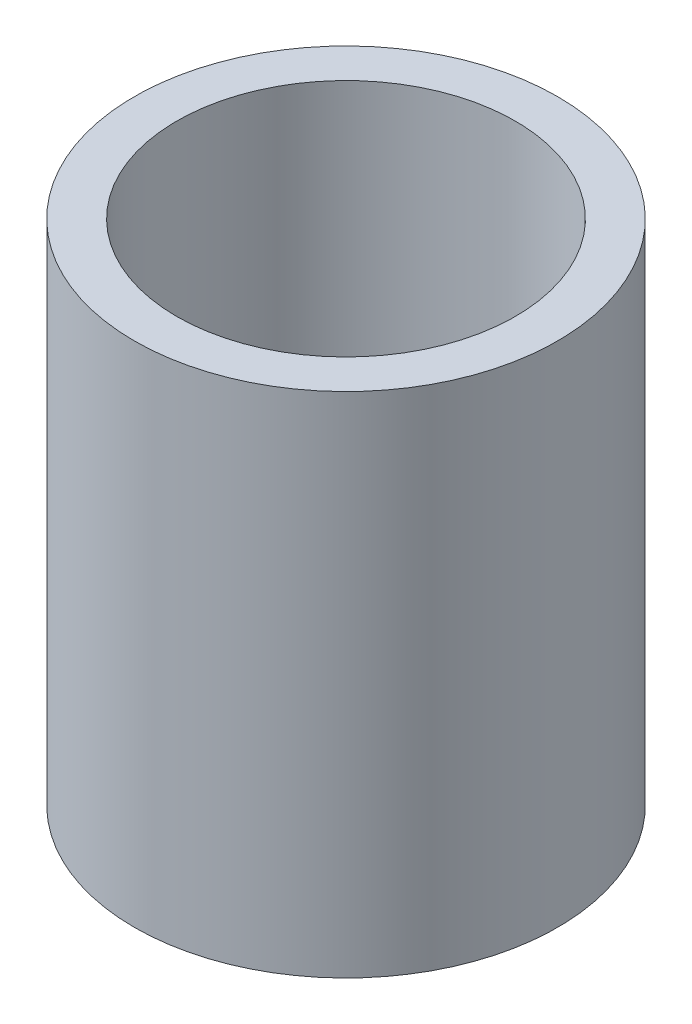
ISO-10303-21;
HEADER;
FILE_DESCRIPTION(('STEP AP214'),'2;1');
FILE_NAME('part.step','',(''),(''),'','','');
FILE_SCHEMA(('AUTOMOTIVE_DESIGN { 1 0 10303 214 1 1 1 1 }'));
ENDSEC;
DATA;
#1=APPLICATION_CONTEXT('core data for automotive mechanical design processes');
#2=APPLICATION_PROTOCOL_DEFINITION('international standard','automotive_design',2000,#1);
#3=PRODUCT_CONTEXT('',#1,'mechanical');
#4=PRODUCT('Part','Part','',(#3));
#5=PRODUCT_RELATED_PRODUCT_CATEGORY('part','',(#4));
#6=PRODUCT_DEFINITION_FORMATION('','',#4);
#7=PRODUCT_DEFINITION_CONTEXT('part definition',#1,'design');
#8=PRODUCT_DEFINITION('design','',#6,#7);
#9=PRODUCT_DEFINITION_SHAPE('','',#8);
#10=(LENGTH_UNIT() NAMED_UNIT(*) SI_UNIT(.MILLI.,.METRE.));
#11=(NAMED_UNIT(*) PLANE_ANGLE_UNIT() SI_UNIT($,.RADIAN.));
#12=(NAMED_UNIT(*) SI_UNIT($,.STERADIAN.) SOLID_ANGLE_UNIT());
#13=UNCERTAINTY_MEASURE_WITH_UNIT(LENGTH_MEASURE(1.E-05),#10,'distance_accuracy_value','');
#14=(GEOMETRIC_REPRESENTATION_CONTEXT(3) GLOBAL_UNCERTAINTY_ASSIGNED_CONTEXT((#13)) GLOBAL_UNIT_ASSIGNED_CONTEXT((#10,
#11,#12)) REPRESENTATION_CONTEXT('',''));
#15=CARTESIAN_POINT('',(0.,0.,0.));
#16=DIRECTION('',(0.,0.,1.));
#17=DIRECTION('',(1.,0.,0.));
#18=AXIS2_PLACEMENT_3D('',#15,#16,#17);
#19=CARTESIAN_POINT('',(0.,60.,0.));
#20=DIRECTION('',(0.,-1.,0.));
#21=DIRECTION('',(0.,0.,-1.));
#22=AXIS2_PLACEMENT_3D('',#19,#20,#21);
#23=CYLINDRICAL_SURFACE('',#22,25.);
#24=CARTESIAN_POINT('',(0.,60.,0.));
#25=DIRECTION('',(0.,1.,0.));
#26=DIRECTION('',(0.,0.,1.));
#27=AXIS2_PLACEMENT_3D('',#24,#25,#26);
#28=CIRCLE('',#27,25.);
#29=CARTESIAN_POINT('',(0.,60.,25.));
#30=VERTEX_POINT('',#29);
#31=EDGE_CURVE('E10',#30,#30,#28,.T.);
#32=ORIENTED_EDGE('',*,*,#31,.F.);
#33=EDGE_LOOP('',(#32));
#34=FACE_BOUND('',#33,.T.);
#35=CARTESIAN_POINT('',(0.,0.,0.));
#36=DIRECTION('',(0.,1.,0.));
#37=DIRECTION('',(0.,0.,1.));
#38=AXIS2_PLACEMENT_3D('',#35,#36,#37);
#39=CIRCLE('',#38,25.);
#40=CARTESIAN_POINT('',(0.,0.,25.));
#41=VERTEX_POINT('',#40);
#42=EDGE_CURVE('E34',#41,#41,#39,.T.);
#43=ORIENTED_EDGE('',*,*,#42,.T.);
#44=EDGE_LOOP('',(#43));
#45=FACE_BOUND('',#44,.T.);
#46=ADVANCED_FACE('F31',(#34,#45),#23,.T.);
#47=CARTESIAN_POINT('',(0.,60.,0.));
#48=DIRECTION('',(0.,1.,0.));
#49=DIRECTION('',(0.,0.,1.));
#50=AXIS2_PLACEMENT_3D('',#47,#48,#49);
#51=PLANE('',#50);
#52=CARTESIAN_POINT('',(0.,60.,0.));
#53=DIRECTION('',(0.,1.,0.));
#54=DIRECTION('',(0.,0.,1.));
#55=AXIS2_PLACEMENT_3D('',#52,#53,#54);
#56=CIRCLE('',#55,20.);
#57=CARTESIAN_POINT('',(0.,60.,20.));
#58=VERTEX_POINT('',#57);
#59=EDGE_CURVE('E43',#58,#58,#56,.T.);
#60=ORIENTED_EDGE('',*,*,#59,.F.);
#61=EDGE_LOOP('',(#60));
#62=FACE_BOUND('',#61,.T.);
#63=ORIENTED_EDGE('',*,*,#31,.T.);
#64=EDGE_LOOP('',(#63));
#65=FACE_BOUND('',#64,.T.);
#66=ADVANCED_FACE('F58',(#62,#65),#51,.T.);
#67=CARTESIAN_POINT('',(0.,0.,0.));
#68=DIRECTION('',(0.,1.,0.));
#69=DIRECTION('',(0.,0.,1.));
#70=AXIS2_PLACEMENT_3D('',#67,#68,#69);
#71=PLANE('',#70);
#72=ORIENTED_EDGE('',*,*,#42,.F.);
#73=EDGE_LOOP('',(#72));
#74=FACE_BOUND('',#73,.T.);
#75=ADVANCED_FACE('F54',(#74),#71,.F.);
#76=CARTESIAN_POINT('',(0.,5.,0.));
#77=DIRECTION('',(0.,1.,0.));
#78=DIRECTION('',(0.,0.,1.));
#79=AXIS2_PLACEMENT_3D('',#76,#77,#78);
#80=CYLINDRICAL_SURFACE('',#79,20.);
#81=CARTESIAN_POINT('',(0.,5.,0.));
#82=DIRECTION('',(0.,1.,0.));
#83=DIRECTION('',(0.,0.,1.));
#84=AXIS2_PLACEMENT_3D('',#81,#82,#83);
#85=CIRCLE('',#84,20.);
#86=CARTESIAN_POINT('',(0.,5.,20.));
#87=VERTEX_POINT('',#86);
#88=EDGE_CURVE('E41',#87,#87,#85,.T.);
#89=ORIENTED_EDGE('',*,*,#88,.F.);
#90=EDGE_LOOP('',(#89));
#91=FACE_BOUND('',#90,.T.);
#92=ORIENTED_EDGE('',*,*,#59,.T.);
#93=EDGE_LOOP('',(#92));
#94=FACE_BOUND('',#93,.T.);
#95=ADVANCED_FACE('F51',(#91,#94),#80,.F.);
#96=CARTESIAN_POINT('',(0.,5.,0.));
#97=DIRECTION('',(0.,1.,0.));
#98=DIRECTION('',(0.,0.,1.));
#99=AXIS2_PLACEMENT_3D('',#96,#97,#98);
#100=PLANE('',#99);
#101=ORIENTED_EDGE('',*,*,#88,.T.);
#102=EDGE_LOOP('',(#101));
#103=FACE_BOUND('',#102,.T.);
#104=ADVANCED_FACE('F49',(#103),#100,.T.);
#105=CLOSED_SHELL('',(#46,#66,#75,#95,#104));
#106=MANIFOLD_SOLID_BREP('B2',#105);
#107=ADVANCED_BREP_SHAPE_REPRESENTATION('',(#18,#106),#14);
#108=SHAPE_DEFINITION_REPRESENTATION(#9,#107);
ENDSEC;
END-ISO-10303-21;
